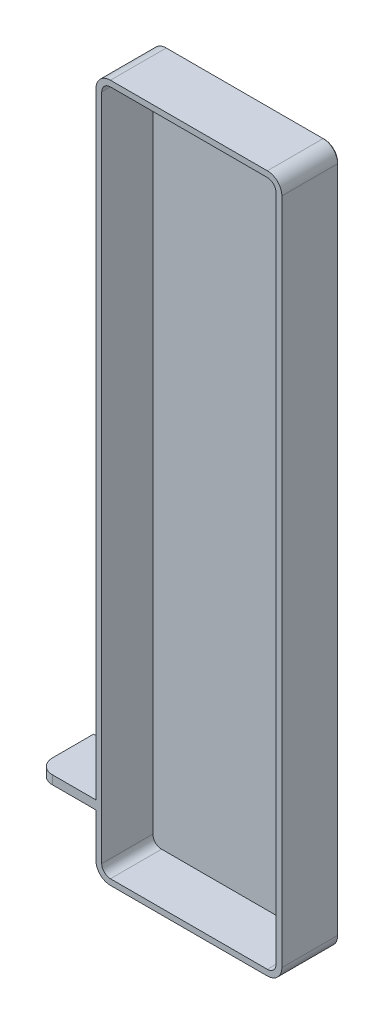
ISO-10303-21;
HEADER;
FILE_DESCRIPTION(('STEP AP214'),'2;1');
FILE_NAME('part.step','',(''),(''),'','','');
FILE_SCHEMA(('AUTOMOTIVE_DESIGN { 1 0 10303 214 1 1 1 1 }'));
ENDSEC;
DATA;
#1=APPLICATION_CONTEXT('core data for automotive mechanical design processes');
#2=APPLICATION_PROTOCOL_DEFINITION('international standard','automotive_design',2000,#1);
#3=PRODUCT_CONTEXT('',#1,'mechanical');
#4=PRODUCT('Part','Part','',(#3));
#5=PRODUCT_RELATED_PRODUCT_CATEGORY('part','',(#4));
#6=PRODUCT_DEFINITION_FORMATION('','',#4);
#7=PRODUCT_DEFINITION_CONTEXT('part definition',#1,'design');
#8=PRODUCT_DEFINITION('design','',#6,#7);
#9=PRODUCT_DEFINITION_SHAPE('','',#8);
#10=(LENGTH_UNIT() NAMED_UNIT(*) SI_UNIT(.MILLI.,.METRE.));
#11=(NAMED_UNIT(*) PLANE_ANGLE_UNIT() SI_UNIT($,.RADIAN.));
#12=(NAMED_UNIT(*) SI_UNIT($,.STERADIAN.) SOLID_ANGLE_UNIT());
#13=UNCERTAINTY_MEASURE_WITH_UNIT(LENGTH_MEASURE(1.E-05),#10,'distance_accuracy_value','');
#14=(GEOMETRIC_REPRESENTATION_CONTEXT(3) GLOBAL_UNCERTAINTY_ASSIGNED_CONTEXT((#13)) GLOBAL_UNIT_ASSIGNED_CONTEXT((#10,
#11,#12)) REPRESENTATION_CONTEXT('',''));
#15=CARTESIAN_POINT('',(0.,0.,0.));
#16=DIRECTION('',(0.,0.,1.));
#17=DIRECTION('',(1.,0.,0.));
#18=AXIS2_PLACEMENT_3D('',#15,#16,#17);
#19=CARTESIAN_POINT('',(-4.54485946099759E-06,240.000002017447,19.6));
#20=DIRECTION('',(1.,0.,0.));
#21=DIRECTION('',(0.,1.,0.));
#22=AXIS2_PLACEMENT_3D('',#19,#20,#21);
#23=PLANE('',#22);
#24=DIRECTION('',(0.,0.,1.));
#25=VECTOR('',#24,1.);
#26=CARTESIAN_POINT('',(-4.54485943324201E-06,20.0000020174472,0.));
#27=LINE('',#26,#25);
#28=CARTESIAN_POINT('',(-4.54485943324201E-06,20.0000020174472,0.400000000000039));
#29=VERTEX_POINT('',#28);
#30=CARTESIAN_POINT('',(-4.54485943324201E-06,20.0000020174472,19.6));
#31=VERTEX_POINT('',#30);
#32=EDGE_CURVE('E432',#29,#31,#27,.T.);
#33=ORIENTED_EDGE('',*,*,#32,.F.);
#34=DIRECTION('',(0.,-1.,0.));
#35=VECTOR('',#34,1.);
#36=CARTESIAN_POINT('',(-4.54485943382025E-06,5.0000020174472,0.400000000000039));
#37=LINE('',#36,#35);
#38=CARTESIAN_POINT('',(-4.54485943324201E-06,5.0000020174472,0.400000000000039));
#39=VERTEX_POINT('',#38);
#40=EDGE_CURVE('E72',#29,#39,#37,.T.);
#41=ORIENTED_EDGE('',*,*,#40,.T.);
#42=DIRECTION('',(0.,0.,-1.));
#43=VECTOR('',#42,1.);
#44=CARTESIAN_POINT('',(-4.54485943324201E-06,5.0000020174472,19.6));
#45=LINE('',#44,#43);
#46=CARTESIAN_POINT('',(-4.54485943324201E-06,5.0000020174472,19.6));
#47=VERTEX_POINT('',#46);
#48=EDGE_CURVE('E318',#39,#47,#45,.F.);
#49=ORIENTED_EDGE('',*,*,#48,.T.);
#50=DIRECTION('',(0.,-1.,0.));
#51=VECTOR('',#50,1.);
#52=CARTESIAN_POINT('',(-4.54485946099759E-06,240.000002017447,19.6));
#53=LINE('',#52,#51);
#54=EDGE_CURVE('E302',#31,#47,#53,.T.);
#55=ORIENTED_EDGE('',*,*,#54,.F.);
#56=EDGE_LOOP('',(#33,#41,#49,#55));
#57=FACE_BOUND('',#56,.T.);
#58=ADVANCED_FACE('F47',(#57),#23,.F.);
#59=DIRECTION('',(0.,0.,-1.));
#60=VECTOR('',#59,1.);
#61=CARTESIAN_POINT('',(-4.54485946099759E-06,235.000002017447,19.6));
#62=LINE('',#61,#60);
#63=CARTESIAN_POINT('',(-4.54485946099759E-06,235.000002017447,19.6));
#64=VERTEX_POINT('',#63);
#65=CARTESIAN_POINT('',(-4.54485946099759E-06,235.000002017447,0.400000000000039));
#66=VERTEX_POINT('',#65);
#67=EDGE_CURVE('E315',#64,#66,#62,.T.);
#68=ORIENTED_EDGE('',*,*,#67,.T.);
#69=DIRECTION('',(0.,-1.,0.));
#70=VECTOR('',#69,1.);
#71=CARTESIAN_POINT('',(-4.54485943590192E-06,23.0000020174472,0.400000000000039));
#72=LINE('',#71,#70);
#73=CARTESIAN_POINT('',(-4.54485943324201E-06,23.0000020174472,0.400000000000039));
#74=VERTEX_POINT('',#73);
#75=EDGE_CURVE('E388',#66,#74,#72,.T.);
#76=ORIENTED_EDGE('',*,*,#75,.T.);
#77=DIRECTION('',(0.,0.,-1.));
#78=VECTOR('',#77,1.);
#79=CARTESIAN_POINT('',(-4.54485943324201E-06,23.0000020174472,0.));
#80=LINE('',#79,#78);
#81=CARTESIAN_POINT('',(-4.54485943324201E-06,23.0000020174472,19.6));
#82=VERTEX_POINT('',#81);
#83=EDGE_CURVE('E437',#82,#74,#80,.T.);
#84=ORIENTED_EDGE('',*,*,#83,.F.);
#85=EDGE_CURVE('E303',#64,#82,#53,.T.);
#86=ORIENTED_EDGE('',*,*,#85,.F.);
#87=EDGE_LOOP('',(#68,#76,#84,#86));
#88=FACE_BOUND('',#87,.T.);
#89=ADVANCED_FACE('F506',(#88),#23,.F.);
#90=CARTESIAN_POINT('',(63.9999954551405,240.000002017447,19.6));
#91=DIRECTION('',(-1.,0.,0.));
#92=DIRECTION('',(0.,-1.,0.));
#93=AXIS2_PLACEMENT_3D('',#90,#91,#92);
#94=PLANE('',#93);
#95=DIRECTION('',(0.,0.,-1.));
#96=VECTOR('',#95,1.);
#97=CARTESIAN_POINT('',(63.9999954551406,5.0000020174472,19.6));
#98=LINE('',#97,#96);
#99=CARTESIAN_POINT('',(63.9999954551406,5.0000020174472,19.6));
#100=VERTEX_POINT('',#99);
#101=CARTESIAN_POINT('',(63.9999954551406,5.0000020174472,0.400000000000039));
#102=VERTEX_POINT('',#101);
#103=EDGE_CURVE('E331',#100,#102,#98,.T.);
#104=ORIENTED_EDGE('',*,*,#103,.T.);
#105=DIRECTION('',(0.,1.,0.));
#106=VECTOR('',#105,1.);
#107=CARTESIAN_POINT('',(63.9999954551405,235.000002017447,0.400000000000039));
#108=LINE('',#107,#106);
#109=CARTESIAN_POINT('',(63.9999954551405,235.000002017447,0.400000000000039));
#110=VERTEX_POINT('',#109);
#111=EDGE_CURVE('E379',#102,#110,#108,.T.);
#112=ORIENTED_EDGE('',*,*,#111,.T.);
#113=DIRECTION('',(0.,0.,-1.));
#114=VECTOR('',#113,1.);
#115=CARTESIAN_POINT('',(63.9999954551405,235.000002017447,19.6));
#116=LINE('',#115,#114);
#117=CARTESIAN_POINT('',(63.9999954551405,235.000002017447,19.6));
#118=VERTEX_POINT('',#117);
#119=EDGE_CURVE('E329',#110,#118,#116,.F.);
#120=ORIENTED_EDGE('',*,*,#119,.T.);
#121=DIRECTION('',(0.,1.,0.));
#122=VECTOR('',#121,1.);
#123=CARTESIAN_POINT('',(63.9999954551405,240.000002017447,19.6));
#124=LINE('',#123,#122);
#125=EDGE_CURVE('E295',#100,#118,#124,.T.);
#126=ORIENTED_EDGE('',*,*,#125,.F.);
#127=EDGE_LOOP('',(#104,#112,#120,#126));
#128=FACE_BOUND('',#127,.T.);
#129=ADVANCED_FACE('F513',(#128),#94,.F.);
#130=CARTESIAN_POINT('',(63.9999954551405,240.000002017447,19.6));
#131=DIRECTION('',(0.,-1.,0.));
#132=DIRECTION('',(0.,0.,-1.));
#133=AXIS2_PLACEMENT_3D('',#130,#131,#132);
#134=PLANE('',#133);
#135=DIRECTION('',(0.,0.,-1.));
#136=VECTOR('',#135,1.);
#137=CARTESIAN_POINT('',(58.9999954551405,240.000002017447,19.6));
#138=LINE('',#137,#136);
#139=CARTESIAN_POINT('',(58.9999954551405,240.000002017447,19.6));
#140=VERTEX_POINT('',#139);
#141=CARTESIAN_POINT('',(58.9999954551405,240.000002017447,0.400000000000039));
#142=VERTEX_POINT('',#141);
#143=EDGE_CURVE('E336',#140,#142,#138,.T.);
#144=ORIENTED_EDGE('',*,*,#143,.T.);
#145=DIRECTION('',(-1.,0.,0.));
#146=VECTOR('',#145,1.);
#147=CARTESIAN_POINT('',(4.99999545514054,240.000002017447,0.400000000000039));
#148=LINE('',#147,#146);
#149=CARTESIAN_POINT('',(4.99999545514054,240.000002017447,0.400000000000039));
#150=VERTEX_POINT('',#149);
#151=EDGE_CURVE('E384',#142,#150,#148,.T.);
#152=ORIENTED_EDGE('',*,*,#151,.T.);
#153=DIRECTION('',(0.,0.,-1.));
#154=VECTOR('',#153,1.);
#155=CARTESIAN_POINT('',(4.99999545514054,240.000002017447,19.6));
#156=LINE('',#155,#154);
#157=CARTESIAN_POINT('',(4.99999545514054,240.000002017447,19.6));
#158=VERTEX_POINT('',#157);
#159=EDGE_CURVE('E334',#150,#158,#156,.F.);
#160=ORIENTED_EDGE('',*,*,#159,.T.);
#161=DIRECTION('',(-1.,0.,0.));
#162=VECTOR('',#161,1.);
#163=CARTESIAN_POINT('',(63.9999954551405,240.000002017447,19.6));
#164=LINE('',#163,#162);
#165=EDGE_CURVE('E299',#140,#158,#164,.T.);
#166=ORIENTED_EDGE('',*,*,#165,.F.);
#167=EDGE_LOOP('',(#144,#152,#160,#166));
#168=FACE_BOUND('',#167,.T.);
#169=ADVANCED_FACE('F519',(#168),#134,.F.);
#170=CARTESIAN_POINT('',(63.9999954551406,2.01744719237687E-06,19.6));
#171=DIRECTION('',(0.,1.,0.));
#172=DIRECTION('',(-1.,0.,0.));
#173=AXIS2_PLACEMENT_3D('',#170,#171,#172);
#174=PLANE('',#173);
#175=DIRECTION('',(0.,0.,-1.));
#176=VECTOR('',#175,1.);
#177=CARTESIAN_POINT('',(4.99999545514057,2.01744718598008E-06,19.6));
#178=LINE('',#177,#176);
#179=CARTESIAN_POINT('',(4.99999545514057,2.01744718598008E-06,19.6));
#180=VERTEX_POINT('',#179);
#181=CARTESIAN_POINT('',(4.99999545514057,2.01744718598008E-06,0.400000000000039));
#182=VERTEX_POINT('',#181);
#183=EDGE_CURVE('E313',#180,#182,#178,.T.);
#184=ORIENTED_EDGE('',*,*,#183,.T.);
#185=DIRECTION('',(1.,0.,0.));
#186=VECTOR('',#185,1.);
#187=CARTESIAN_POINT('',(58.9999954551406,2.01744719183477E-06,0.400000000000039));
#188=LINE('',#187,#186);
#189=CARTESIAN_POINT('',(58.9999954551406,2.01744719183477E-06,0.400000000000039));
#190=VERTEX_POINT('',#189);
#191=EDGE_CURVE('E12',#182,#190,#188,.T.);
#192=ORIENTED_EDGE('',*,*,#191,.T.);
#193=DIRECTION('',(0.,0.,-1.));
#194=VECTOR('',#193,1.);
#195=CARTESIAN_POINT('',(58.9999954551406,2.01744719183477E-06,19.6));
#196=LINE('',#195,#194);
#197=CARTESIAN_POINT('',(58.9999954551406,2.01744719183477E-06,19.6));
#198=VERTEX_POINT('',#197);
#199=EDGE_CURVE('E310',#190,#198,#196,.F.);
#200=ORIENTED_EDGE('',*,*,#199,.T.);
#201=DIRECTION('',(1.,0.,0.));
#202=VECTOR('',#201,1.);
#203=CARTESIAN_POINT('',(63.9999954551406,2.01744719237687E-06,19.6));
#204=LINE('',#203,#202);
#205=EDGE_CURVE('E306',#180,#198,#204,.T.);
#206=ORIENTED_EDGE('',*,*,#205,.F.);
#207=EDGE_LOOP('',(#184,#192,#200,#206));
#208=FACE_BOUND('',#207,.T.);
#209=ADVANCED_FACE('F517',(#208),#174,.F.);
#210=CARTESIAN_POINT('',(150.76986,-0.56542,19.6));
#211=DIRECTION('',(0.,0.,-1.));
#212=DIRECTION('',(-1.,0.,0.));
#213=AXIS2_PLACEMENT_3D('',#210,#211,#212);
#214=PLANE('',#213);
#215=CARTESIAN_POINT('',(4.99999545514057,5.00000201744719,19.6));
#216=DIRECTION('',(0.,0.,1.));
#217=DIRECTION('',(1.,0.,0.));
#218=AXIS2_PLACEMENT_3D('',#215,#216,#217);
#219=CIRCLE('',#218,3.);
#220=CARTESIAN_POINT('',(1.99999545514057,5.0000020174472,19.6));
#221=VERTEX_POINT('',#220);
#222=CARTESIAN_POINT('',(4.99999545514057,2.00000201744718,19.6));
#223=VERTEX_POINT('',#222);
#224=EDGE_CURVE('E467',#221,#223,#219,.T.);
#225=ORIENTED_EDGE('',*,*,#224,.F.);
#226=DIRECTION('',(0.,-1.,0.));
#227=VECTOR('',#226,1.);
#228=CARTESIAN_POINT('',(1.99999545514054,235.000002017447,19.6));
#229=LINE('',#228,#227);
#230=CARTESIAN_POINT('',(1.99999545514054,235.000002017447,19.6));
#231=VERTEX_POINT('',#230);
#232=EDGE_CURVE('E247',#231,#221,#229,.T.);
#233=ORIENTED_EDGE('',*,*,#232,.F.);
#234=CARTESIAN_POINT('',(4.99999545514054,235.000002017447,19.6));
#235=DIRECTION('',(0.,0.,1.));
#236=DIRECTION('',(1.,0.,0.));
#237=AXIS2_PLACEMENT_3D('',#234,#235,#236);
#238=CIRCLE('',#237,3.);
#239=CARTESIAN_POINT('',(4.99999545514054,238.000002017447,19.6));
#240=VERTEX_POINT('',#239);
#241=EDGE_CURVE('E263',#240,#231,#238,.T.);
#242=ORIENTED_EDGE('',*,*,#241,.F.);
#243=DIRECTION('',(-1.,0.,0.));
#244=VECTOR('',#243,1.);
#245=CARTESIAN_POINT('',(58.9999954551405,238.000002017447,19.6));
#246=LINE('',#245,#244);
#247=CARTESIAN_POINT('',(58.9999954551405,238.000002017447,19.6));
#248=VERTEX_POINT('',#247);
#249=EDGE_CURVE('E255',#248,#240,#246,.T.);
#250=ORIENTED_EDGE('',*,*,#249,.F.);
#251=CARTESIAN_POINT('',(58.9999954551405,235.000002017447,19.6));
#252=DIRECTION('',(0.,0.,1.));
#253=DIRECTION('',(1.,0.,0.));
#254=AXIS2_PLACEMENT_3D('',#251,#252,#253);
#255=CIRCLE('',#254,3.);
#256=CARTESIAN_POINT('',(61.9999954551405,235.000002017447,19.6));
#257=VERTEX_POINT('',#256);
#258=EDGE_CURVE('E259',#257,#248,#255,.T.);
#259=ORIENTED_EDGE('',*,*,#258,.F.);
#260=DIRECTION('',(0.,1.,0.));
#261=VECTOR('',#260,1.);
#262=CARTESIAN_POINT('',(61.9999954551406,5.0000020174472,19.6));
#263=LINE('',#262,#261);
#264=CARTESIAN_POINT('',(61.9999954551406,5.0000020174472,19.6));
#265=VERTEX_POINT('',#264);
#266=EDGE_CURVE('E455',#265,#257,#263,.T.);
#267=ORIENTED_EDGE('',*,*,#266,.F.);
#268=CARTESIAN_POINT('',(58.9999954551406,5.0000020174472,19.6));
#269=DIRECTION('',(0.,0.,1.));
#270=DIRECTION('',(1.,0.,0.));
#271=AXIS2_PLACEMENT_3D('',#268,#269,#270);
#272=CIRCLE('',#271,3.);
#273=CARTESIAN_POINT('',(58.9999954551406,2.00000201744719,19.6));
#274=VERTEX_POINT('',#273);
#275=EDGE_CURVE('E459',#274,#265,#272,.T.);
#276=ORIENTED_EDGE('',*,*,#275,.F.);
#277=DIRECTION('',(1.,0.,0.));
#278=VECTOR('',#277,1.);
#279=CARTESIAN_POINT('',(4.99999545514057,2.00000201744718,19.6));
#280=LINE('',#279,#278);
#281=EDGE_CURVE('E463',#223,#274,#280,.T.);
#282=ORIENTED_EDGE('',*,*,#281,.F.);
#283=EDGE_LOOP('',(#225,#233,#242,#250,#259,#267,#276,#282));
#284=FACE_BOUND('',#283,.T.);
#285=DIRECTION('',(1.,0.,0.));
#286=VECTOR('',#285,1.);
#287=CARTESIAN_POINT('',(-20.0000045448594,23.0000020174472,19.6));
#288=LINE('',#287,#286);
#289=CARTESIAN_POINT('',(-15.0000045448594,23.0000020174472,19.6));
#290=VERTEX_POINT('',#289);
#291=EDGE_CURVE('E449',#290,#82,#288,.T.);
#292=ORIENTED_EDGE('',*,*,#291,.F.);
#293=DIRECTION('',(0.,1.,0.));
#294=VECTOR('',#293,1.);
#295=CARTESIAN_POINT('',(-15.0000045448594,20.0000020174472,19.6));
#296=LINE('',#295,#294);
#297=CARTESIAN_POINT('',(-15.0000045448594,20.0000020174472,19.6));
#298=VERTEX_POINT('',#297);
#299=EDGE_CURVE('E344',#290,#298,#296,.F.);
#300=ORIENTED_EDGE('',*,*,#299,.T.);
#301=DIRECTION('',(1.,0.,0.));
#302=VECTOR('',#301,1.);
#303=CARTESIAN_POINT('',(-20.0000045448594,20.0000020174472,19.6));
#304=LINE('',#303,#302);
#305=EDGE_CURVE('E451',#298,#31,#304,.T.);
#306=ORIENTED_EDGE('',*,*,#305,.T.);
#307=ORIENTED_EDGE('',*,*,#54,.T.);
#308=CARTESIAN_POINT('',(4.99999545514057,5.00000201744719,19.6));
#309=DIRECTION('',(0.,0.,-1.));
#310=DIRECTION('',(-1.,0.,0.));
#311=AXIS2_PLACEMENT_3D('',#308,#309,#310);
#312=CIRCLE('',#311,5.);
#313=EDGE_CURVE('E327',#47,#180,#312,.F.);
#314=ORIENTED_EDGE('',*,*,#313,.T.);
#315=ORIENTED_EDGE('',*,*,#205,.T.);
#316=CARTESIAN_POINT('',(58.9999954551406,5.0000020174472,19.6));
#317=DIRECTION('',(0.,0.,-1.));
#318=DIRECTION('',(-1.,0.,0.));
#319=AXIS2_PLACEMENT_3D('',#316,#317,#318);
#320=CIRCLE('',#319,5.);
#321=EDGE_CURVE('E324',#198,#100,#320,.F.);
#322=ORIENTED_EDGE('',*,*,#321,.T.);
#323=ORIENTED_EDGE('',*,*,#125,.T.);
#324=CARTESIAN_POINT('',(58.9999954551405,235.000002017447,19.6));
#325=DIRECTION('',(0.,0.,-1.));
#326=DIRECTION('',(-1.,0.,0.));
#327=AXIS2_PLACEMENT_3D('',#324,#325,#326);
#328=CIRCLE('',#327,5.);
#329=EDGE_CURVE('E322',#118,#140,#328,.F.);
#330=ORIENTED_EDGE('',*,*,#329,.T.);
#331=ORIENTED_EDGE('',*,*,#165,.T.);
#332=CARTESIAN_POINT('',(4.99999545514054,235.000002017447,19.6));
#333=DIRECTION('',(0.,0.,-1.));
#334=DIRECTION('',(-1.,0.,0.));
#335=AXIS2_PLACEMENT_3D('',#332,#333,#334);
#336=CIRCLE('',#335,5.);
#337=EDGE_CURVE('E320',#158,#64,#336,.F.);
#338=ORIENTED_EDGE('',*,*,#337,.T.);
#339=ORIENTED_EDGE('',*,*,#85,.T.);
#340=EDGE_LOOP('',(#292,#300,#306,#307,#314,#315,#322,#323,#330,#331,#338,#339));
#341=FACE_BOUND('',#340,.T.);
#342=ADVANCED_FACE('F476',(#284,#341),#214,.F.);
#343=CARTESIAN_POINT('',(150.76986,-0.56542,0.));
#344=DIRECTION('',(0.,0.,-1.));
#345=DIRECTION('',(-1.,0.,0.));
#346=AXIS2_PLACEMENT_3D('',#343,#344,#345);
#347=PLANE('',#346);
#348=DIRECTION('',(0.,-1.,0.));
#349=VECTOR('',#348,1.);
#350=CARTESIAN_POINT('',(63.5999954551405,5.0000020174472,0.));
#351=LINE('',#350,#349);
#352=CARTESIAN_POINT('',(63.5999954551405,235.000002017447,0.));
#353=VERTEX_POINT('',#352);
#354=CARTESIAN_POINT('',(63.5999954551405,5.0000020174472,0.));
#355=VERTEX_POINT('',#354);
#356=EDGE_CURVE('E370',#353,#355,#351,.T.);
#357=ORIENTED_EDGE('',*,*,#356,.T.);
#358=CARTESIAN_POINT('',(58.9999954551406,5.0000020174472,0.));
#359=DIRECTION('',(0.,0.,-1.));
#360=DIRECTION('',(-1.,0.,0.));
#361=AXIS2_PLACEMENT_3D('',#358,#359,#360);
#362=CIRCLE('',#361,4.59999999999997);
#363=CARTESIAN_POINT('',(58.9999954551406,0.400002017447231,0.));
#364=VERTEX_POINT('',#363);
#365=EDGE_CURVE('E373',#355,#364,#362,.T.);
#366=ORIENTED_EDGE('',*,*,#365,.T.);
#367=DIRECTION('',(-1.,0.,0.));
#368=VECTOR('',#367,1.);
#369=CARTESIAN_POINT('',(4.99999545514057,0.400002017447225,0.));
#370=LINE('',#369,#368);
#371=CARTESIAN_POINT('',(4.99999545514057,0.400002017447225,0.));
#372=VERTEX_POINT('',#371);
#373=EDGE_CURVE('E349',#364,#372,#370,.T.);
#374=ORIENTED_EDGE('',*,*,#373,.T.);
#375=CARTESIAN_POINT('',(4.99999545514057,5.00000201744719,0.));
#376=DIRECTION('',(0.,0.,-1.));
#377=DIRECTION('',(-1.,0.,0.));
#378=AXIS2_PLACEMENT_3D('',#375,#376,#377);
#379=CIRCLE('',#378,4.59999999999996);
#380=CARTESIAN_POINT('',(0.399995455140611,5.0000020174472,0.));
#381=VERTEX_POINT('',#380);
#382=EDGE_CURVE('E351',#372,#381,#379,.T.);
#383=ORIENTED_EDGE('',*,*,#382,.T.);
#384=DIRECTION('',(0.,1.,0.));
#385=VECTOR('',#384,1.);
#386=CARTESIAN_POINT('',(0.399995455140604,20.0000020174472,0.));
#387=LINE('',#386,#385);
#388=CARTESIAN_POINT('',(0.399995455140604,20.4000020174472,0.));
#389=VERTEX_POINT('',#388);
#390=EDGE_CURVE('E353',#381,#389,#387,.T.);
#391=ORIENTED_EDGE('',*,*,#390,.T.);
#392=DIRECTION('',(-1.,0.,0.));
#393=VECTOR('',#392,1.);
#394=CARTESIAN_POINT('',(-20.0000045448594,20.4000020174472,0.));
#395=LINE('',#394,#393);
#396=CARTESIAN_POINT('',(-19.6000045448594,20.4000020174472,0.));
#397=VERTEX_POINT('',#396);
#398=EDGE_CURVE('E355',#389,#397,#395,.T.);
#399=ORIENTED_EDGE('',*,*,#398,.T.);
#400=DIRECTION('',(0.,1.,0.));
#401=VECTOR('',#400,1.);
#402=CARTESIAN_POINT('',(-19.6000045448594,-0.56542,0.));
#403=LINE('',#402,#401);
#404=CARTESIAN_POINT('',(-19.6000045448594,22.6000020174472,0.));
#405=VERTEX_POINT('',#404);
#406=EDGE_CURVE('E357',#397,#405,#403,.T.);
#407=ORIENTED_EDGE('',*,*,#406,.T.);
#408=DIRECTION('',(1.,0.,0.));
#409=VECTOR('',#408,1.);
#410=CARTESIAN_POINT('',(-4.54485943319575E-06,22.6000020174472,0.));
#411=LINE('',#410,#409);
#412=CARTESIAN_POINT('',(0.399995455140603,22.6000020174472,0.));
#413=VERTEX_POINT('',#412);
#414=EDGE_CURVE('E359',#405,#413,#411,.T.);
#415=ORIENTED_EDGE('',*,*,#414,.T.);
#416=DIRECTION('',(0.,1.,0.));
#417=VECTOR('',#416,1.);
#418=CARTESIAN_POINT('',(0.399995455140579,235.000002017447,0.));
#419=LINE('',#418,#417);
#420=CARTESIAN_POINT('',(0.399995455140579,235.000002017447,0.));
#421=VERTEX_POINT('',#420);
#422=EDGE_CURVE('E361',#413,#421,#419,.T.);
#423=ORIENTED_EDGE('',*,*,#422,.T.);
#424=CARTESIAN_POINT('',(4.99999545514054,235.000002017447,0.));
#425=DIRECTION('',(0.,0.,-1.));
#426=DIRECTION('',(-1.,0.,0.));
#427=AXIS2_PLACEMENT_3D('',#424,#425,#426);
#428=CIRCLE('',#427,4.59999999999997);
#429=CARTESIAN_POINT('',(4.99999545514054,239.600002017447,0.));
#430=VERTEX_POINT('',#429);
#431=EDGE_CURVE('E364',#421,#430,#428,.T.);
#432=ORIENTED_EDGE('',*,*,#431,.T.);
#433=DIRECTION('',(1.,0.,0.));
#434=VECTOR('',#433,1.);
#435=CARTESIAN_POINT('',(58.9999954551405,239.600002017447,0.));
#436=LINE('',#435,#434);
#437=CARTESIAN_POINT('',(58.9999954551405,239.600002017447,0.));
#438=VERTEX_POINT('',#437);
#439=EDGE_CURVE('E366',#430,#438,#436,.T.);
#440=ORIENTED_EDGE('',*,*,#439,.T.);
#441=CARTESIAN_POINT('',(58.9999954551405,235.000002017447,0.));
#442=DIRECTION('',(0.,0.,-1.));
#443=DIRECTION('',(-1.,0.,0.));
#444=AXIS2_PLACEMENT_3D('',#441,#442,#443);
#445=CIRCLE('',#444,4.59999999999997);
#446=EDGE_CURVE('E368',#438,#353,#445,.T.);
#447=ORIENTED_EDGE('',*,*,#446,.T.);
#448=EDGE_LOOP('',(#357,#366,#374,#383,#391,#399,#407,#415,#423,#432,#440,#447));
#449=FACE_BOUND('',#448,.T.);
#450=ADVANCED_FACE('F530',(#449),#347,.T.);
#451=CARTESIAN_POINT('',(4.99999545514057,5.00000201744719,19.6));
#452=DIRECTION('',(0.,0.,-1.));
#453=DIRECTION('',(-1.,0.,0.));
#454=AXIS2_PLACEMENT_3D('',#451,#452,#453);
#455=CYLINDRICAL_SURFACE('',#454,5.);
#456=ORIENTED_EDGE('',*,*,#48,.F.);
#457=CARTESIAN_POINT('',(4.99999545514057,5.00000201744719,0.400000000000039));
#458=DIRECTION('',(0.,0.,-1.));
#459=DIRECTION('',(-1.,0.,0.));
#460=AXIS2_PLACEMENT_3D('',#457,#458,#459);
#461=CIRCLE('',#460,5.);
#462=EDGE_CURVE('E57',#39,#182,#461,.F.);
#463=ORIENTED_EDGE('',*,*,#462,.T.);
#464=ORIENTED_EDGE('',*,*,#183,.F.);
#465=ORIENTED_EDGE('',*,*,#313,.F.);
#466=EDGE_LOOP('',(#456,#463,#464,#465));
#467=FACE_BOUND('',#466,.T.);
#468=ADVANCED_FACE('F526',(#467),#455,.T.);
#469=CARTESIAN_POINT('',(58.9999954551406,5.0000020174472,19.6));
#470=DIRECTION('',(0.,0.,-1.));
#471=DIRECTION('',(-1.,0.,0.));
#472=AXIS2_PLACEMENT_3D('',#469,#470,#471);
#473=CYLINDRICAL_SURFACE('',#472,5.);
#474=ORIENTED_EDGE('',*,*,#199,.F.);
#475=CARTESIAN_POINT('',(58.9999954551406,5.0000020174472,0.400000000000039));
#476=DIRECTION('',(0.,0.,-1.));
#477=DIRECTION('',(-1.,0.,0.));
#478=AXIS2_PLACEMENT_3D('',#475,#476,#477);
#479=CIRCLE('',#478,5.);
#480=EDGE_CURVE('E376',#190,#102,#479,.F.);
#481=ORIENTED_EDGE('',*,*,#480,.T.);
#482=ORIENTED_EDGE('',*,*,#103,.F.);
#483=ORIENTED_EDGE('',*,*,#321,.F.);
#484=EDGE_LOOP('',(#474,#481,#482,#483));
#485=FACE_BOUND('',#484,.T.);
#486=ADVANCED_FACE('F529',(#485),#473,.T.);
#487=CARTESIAN_POINT('',(58.9999954551405,235.000002017447,19.6));
#488=DIRECTION('',(0.,0.,-1.));
#489=DIRECTION('',(-1.,0.,0.));
#490=AXIS2_PLACEMENT_3D('',#487,#488,#489);
#491=CYLINDRICAL_SURFACE('',#490,5.);
#492=ORIENTED_EDGE('',*,*,#119,.F.);
#493=CARTESIAN_POINT('',(58.9999954551405,235.000002017447,0.400000000000039));
#494=DIRECTION('',(0.,0.,-1.));
#495=DIRECTION('',(-1.,0.,0.));
#496=AXIS2_PLACEMENT_3D('',#493,#494,#495);
#497=CIRCLE('',#496,5.);
#498=EDGE_CURVE('E382',#110,#142,#497,.F.);
#499=ORIENTED_EDGE('',*,*,#498,.T.);
#500=ORIENTED_EDGE('',*,*,#143,.F.);
#501=ORIENTED_EDGE('',*,*,#329,.F.);
#502=EDGE_LOOP('',(#492,#499,#500,#501));
#503=FACE_BOUND('',#502,.T.);
#504=ADVANCED_FACE('F533',(#503),#491,.T.);
#505=CARTESIAN_POINT('',(4.99999545514054,235.000002017447,19.6));
#506=DIRECTION('',(0.,0.,-1.));
#507=DIRECTION('',(-1.,0.,0.));
#508=AXIS2_PLACEMENT_3D('',#505,#506,#507);
#509=CYLINDRICAL_SURFACE('',#508,5.);
#510=ORIENTED_EDGE('',*,*,#159,.F.);
#511=CARTESIAN_POINT('',(4.99999545514054,235.000002017447,0.400000000000039));
#512=DIRECTION('',(0.,0.,-1.));
#513=DIRECTION('',(-1.,0.,0.));
#514=AXIS2_PLACEMENT_3D('',#511,#512,#513);
#515=CIRCLE('',#514,5.);
#516=EDGE_CURVE('E386',#150,#66,#515,.F.);
#517=ORIENTED_EDGE('',*,*,#516,.T.);
#518=ORIENTED_EDGE('',*,*,#67,.F.);
#519=ORIENTED_EDGE('',*,*,#337,.F.);
#520=EDGE_LOOP('',(#510,#517,#518,#519));
#521=FACE_BOUND('',#520,.T.);
#522=ADVANCED_FACE('F537',(#521),#509,.T.);
#523=CARTESIAN_POINT('',(150.76986,-0.56542,2.));
#524=DIRECTION('',(0.,0.,-1.));
#525=DIRECTION('',(-1.,0.,0.));
#526=AXIS2_PLACEMENT_3D('',#523,#524,#525);
#527=PLANE('',#526);
#528=CARTESIAN_POINT('',(4.99999545514054,235.000002017447,2.));
#529=DIRECTION('',(0.,0.,-1.));
#530=DIRECTION('',(-1.,0.,0.));
#531=AXIS2_PLACEMENT_3D('',#528,#529,#530);
#532=CIRCLE('',#531,3.);
#533=CARTESIAN_POINT('',(4.99999545514054,238.000002017447,2.));
#534=VERTEX_POINT('',#533);
#535=CARTESIAN_POINT('',(1.99999545514054,235.000002017447,2.));
#536=VERTEX_POINT('',#535);
#537=EDGE_CURVE('E252',#534,#536,#532,.F.);
#538=ORIENTED_EDGE('',*,*,#537,.T.);
#539=DIRECTION('',(0.,-1.,0.));
#540=VECTOR('',#539,1.);
#541=CARTESIAN_POINT('',(1.99999545514054,235.000002017447,2.));
#542=LINE('',#541,#540);
#543=CARTESIAN_POINT('',(1.99999545514057,5.0000020174472,2.));
#544=VERTEX_POINT('',#543);
#545=EDGE_CURVE('E244',#536,#544,#542,.T.);
#546=ORIENTED_EDGE('',*,*,#545,.T.);
#547=CARTESIAN_POINT('',(4.99999545514057,5.00000201744719,2.));
#548=DIRECTION('',(0.,0.,-1.));
#549=DIRECTION('',(-1.,0.,0.));
#550=AXIS2_PLACEMENT_3D('',#547,#548,#549);
#551=CIRCLE('',#550,3.);
#552=CARTESIAN_POINT('',(4.99999545514057,2.00000201744718,2.));
#553=VERTEX_POINT('',#552);
#554=EDGE_CURVE('E231',#544,#553,#551,.F.);
#555=ORIENTED_EDGE('',*,*,#554,.T.);
#556=DIRECTION('',(1.,0.,0.));
#557=VECTOR('',#556,1.);
#558=CARTESIAN_POINT('',(4.99999545514057,2.00000201744718,2.));
#559=LINE('',#558,#557);
#560=CARTESIAN_POINT('',(58.9999954551406,2.00000201744719,2.));
#561=VERTEX_POINT('',#560);
#562=EDGE_CURVE('E284',#553,#561,#559,.T.);
#563=ORIENTED_EDGE('',*,*,#562,.T.);
#564=CARTESIAN_POINT('',(58.9999954551406,5.0000020174472,2.));
#565=DIRECTION('',(0.,0.,-1.));
#566=DIRECTION('',(-1.,0.,0.));
#567=AXIS2_PLACEMENT_3D('',#564,#565,#566);
#568=CIRCLE('',#567,3.);
#569=CARTESIAN_POINT('',(61.9999954551406,5.0000020174472,2.));
#570=VERTEX_POINT('',#569);
#571=EDGE_CURVE('E280',#561,#570,#568,.F.);
#572=ORIENTED_EDGE('',*,*,#571,.T.);
#573=DIRECTION('',(0.,1.,0.));
#574=VECTOR('',#573,1.);
#575=CARTESIAN_POINT('',(61.9999954551406,5.0000020174472,2.));
#576=LINE('',#575,#574);
#577=CARTESIAN_POINT('',(61.9999954551405,235.000002017447,2.));
#578=VERTEX_POINT('',#577);
#579=EDGE_CURVE('E275',#570,#578,#576,.T.);
#580=ORIENTED_EDGE('',*,*,#579,.T.);
#581=CARTESIAN_POINT('',(58.9999954551405,235.000002017447,2.));
#582=DIRECTION('',(0.,0.,-1.));
#583=DIRECTION('',(-1.,0.,0.));
#584=AXIS2_PLACEMENT_3D('',#581,#582,#583);
#585=CIRCLE('',#584,3.);
#586=CARTESIAN_POINT('',(58.9999954551405,238.000002017447,2.));
#587=VERTEX_POINT('',#586);
#588=EDGE_CURVE('E271',#578,#587,#585,.F.);
#589=ORIENTED_EDGE('',*,*,#588,.T.);
#590=DIRECTION('',(-1.,0.,0.));
#591=VECTOR('',#590,1.);
#592=CARTESIAN_POINT('',(58.9999954551405,238.000002017447,2.));
#593=LINE('',#592,#591);
#594=EDGE_CURVE('E268',#587,#534,#593,.T.);
#595=ORIENTED_EDGE('',*,*,#594,.T.);
#596=EDGE_LOOP('',(#538,#546,#555,#563,#572,#580,#589,#595));
#597=FACE_BOUND('',#596,.T.);
#598=ADVANCED_FACE('F250',(#597),#527,.F.);
#599=CARTESIAN_POINT('',(1.99999545514054,235.000002017447,-243.507700083591));
#600=DIRECTION('',(-1.,0.,0.));
#601=DIRECTION('',(0.,-1.,0.));
#602=AXIS2_PLACEMENT_3D('',#599,#600,#601);
#603=PLANE('',#602);
#604=DIRECTION('',(0.,0.,1.));
#605=VECTOR('',#604,1.);
#606=CARTESIAN_POINT('',(1.99999545514054,235.000002017447,-243.507700083591));
#607=LINE('',#606,#605);
#608=EDGE_CURVE('E266',#536,#231,#607,.T.);
#609=ORIENTED_EDGE('',*,*,#608,.T.);
#610=ORIENTED_EDGE('',*,*,#232,.T.);
#611=DIRECTION('',(0.,0.,1.));
#612=VECTOR('',#611,1.);
#613=CARTESIAN_POINT('',(1.99999545514057,5.0000020174472,-243.507700083591));
#614=LINE('',#613,#612);
#615=EDGE_CURVE('E235',#544,#221,#614,.T.);
#616=ORIENTED_EDGE('',*,*,#615,.F.);
#617=ORIENTED_EDGE('',*,*,#545,.F.);
#618=EDGE_LOOP('',(#609,#610,#616,#617));
#619=FACE_BOUND('',#618,.T.);
#620=ADVANCED_FACE('F243',(#619),#603,.F.);
#621=CARTESIAN_POINT('',(4.99999545514057,5.00000201744719,-243.507700083591));
#622=DIRECTION('',(0.,0.,1.));
#623=DIRECTION('',(1.,0.,0.));
#624=AXIS2_PLACEMENT_3D('',#621,#622,#623);
#625=CYLINDRICAL_SURFACE('',#624,3.);
#626=ORIENTED_EDGE('',*,*,#615,.T.);
#627=ORIENTED_EDGE('',*,*,#224,.T.);
#628=DIRECTION('',(0.,0.,1.));
#629=VECTOR('',#628,1.);
#630=CARTESIAN_POINT('',(4.99999545514057,2.00000201744718,-243.507700083591));
#631=LINE('',#630,#629);
#632=EDGE_CURVE('E237',#553,#223,#631,.T.);
#633=ORIENTED_EDGE('',*,*,#632,.F.);
#634=ORIENTED_EDGE('',*,*,#554,.F.);
#635=EDGE_LOOP('',(#626,#627,#633,#634));
#636=FACE_BOUND('',#635,.T.);
#637=ADVANCED_FACE('F233',(#636),#625,.F.);
#638=CARTESIAN_POINT('',(4.99999545514057,2.00000201744718,-243.507700083591));
#639=DIRECTION('',(0.,-1.,0.));
#640=DIRECTION('',(1.,0.,0.));
#641=AXIS2_PLACEMENT_3D('',#638,#639,#640);
#642=PLANE('',#641);
#643=ORIENTED_EDGE('',*,*,#632,.T.);
#644=ORIENTED_EDGE('',*,*,#281,.T.);
#645=DIRECTION('',(0.,0.,1.));
#646=VECTOR('',#645,1.);
#647=CARTESIAN_POINT('',(58.9999954551406,2.00000201744719,-243.507700083591));
#648=LINE('',#647,#646);
#649=EDGE_CURVE('E283',#561,#274,#648,.T.);
#650=ORIENTED_EDGE('',*,*,#649,.F.);
#651=ORIENTED_EDGE('',*,*,#562,.F.);
#652=EDGE_LOOP('',(#643,#644,#650,#651));
#653=FACE_BOUND('',#652,.T.);
#654=ADVANCED_FACE('F483',(#653),#642,.F.);
#655=CARTESIAN_POINT('',(58.9999954551406,5.0000020174472,-243.507700083591));
#656=DIRECTION('',(0.,0.,1.));
#657=DIRECTION('',(1.,0.,0.));
#658=AXIS2_PLACEMENT_3D('',#655,#656,#657);
#659=CYLINDRICAL_SURFACE('',#658,3.);
#660=ORIENTED_EDGE('',*,*,#649,.T.);
#661=ORIENTED_EDGE('',*,*,#275,.T.);
#662=DIRECTION('',(0.,0.,1.));
#663=VECTOR('',#662,1.);
#664=CARTESIAN_POINT('',(61.9999954551406,5.0000020174472,-243.507700083591));
#665=LINE('',#664,#663);
#666=EDGE_CURVE('E279',#570,#265,#665,.T.);
#667=ORIENTED_EDGE('',*,*,#666,.F.);
#668=ORIENTED_EDGE('',*,*,#571,.F.);
#669=EDGE_LOOP('',(#660,#661,#667,#668));
#670=FACE_BOUND('',#669,.T.);
#671=ADVANCED_FACE('F486',(#670),#659,.F.);
#672=CARTESIAN_POINT('',(61.9999954551406,5.0000020174472,-243.507700083591));
#673=DIRECTION('',(1.,0.,0.));
#674=DIRECTION('',(0.,1.,0.));
#675=AXIS2_PLACEMENT_3D('',#672,#673,#674);
#676=PLANE('',#675);
#677=ORIENTED_EDGE('',*,*,#666,.T.);
#678=ORIENTED_EDGE('',*,*,#266,.T.);
#679=DIRECTION('',(0.,0.,1.));
#680=VECTOR('',#679,1.);
#681=CARTESIAN_POINT('',(61.9999954551405,235.000002017447,-243.507700083591));
#682=LINE('',#681,#680);
#683=EDGE_CURVE('E274',#578,#257,#682,.T.);
#684=ORIENTED_EDGE('',*,*,#683,.F.);
#685=ORIENTED_EDGE('',*,*,#579,.F.);
#686=EDGE_LOOP('',(#677,#678,#684,#685));
#687=FACE_BOUND('',#686,.T.);
#688=ADVANCED_FACE('F488',(#687),#676,.F.);
#689=CARTESIAN_POINT('',(58.9999954551405,235.000002017447,-243.507700083591));
#690=DIRECTION('',(0.,0.,1.));
#691=DIRECTION('',(1.,0.,0.));
#692=AXIS2_PLACEMENT_3D('',#689,#690,#691);
#693=CYLINDRICAL_SURFACE('',#692,3.);
#694=ORIENTED_EDGE('',*,*,#683,.T.);
#695=ORIENTED_EDGE('',*,*,#258,.T.);
#696=DIRECTION('',(0.,0.,1.));
#697=VECTOR('',#696,1.);
#698=CARTESIAN_POINT('',(58.9999954551405,238.000002017447,-243.507700083591));
#699=LINE('',#698,#697);
#700=EDGE_CURVE('E270',#587,#248,#699,.T.);
#701=ORIENTED_EDGE('',*,*,#700,.F.);
#702=ORIENTED_EDGE('',*,*,#588,.F.);
#703=EDGE_LOOP('',(#694,#695,#701,#702));
#704=FACE_BOUND('',#703,.T.);
#705=ADVANCED_FACE('F492',(#704),#693,.F.);
#706=CARTESIAN_POINT('',(58.9999954551405,238.000002017447,-243.507700083591));
#707=DIRECTION('',(0.,1.,0.));
#708=DIRECTION('',(0.,0.,1.));
#709=AXIS2_PLACEMENT_3D('',#706,#707,#708);
#710=PLANE('',#709);
#711=ORIENTED_EDGE('',*,*,#700,.T.);
#712=ORIENTED_EDGE('',*,*,#249,.T.);
#713=DIRECTION('',(0.,0.,1.));
#714=VECTOR('',#713,1.);
#715=CARTESIAN_POINT('',(4.99999545514054,238.000002017447,-243.507700083591));
#716=LINE('',#715,#714);
#717=EDGE_CURVE('E267',#534,#240,#716,.T.);
#718=ORIENTED_EDGE('',*,*,#717,.F.);
#719=ORIENTED_EDGE('',*,*,#594,.F.);
#720=EDGE_LOOP('',(#711,#712,#718,#719));
#721=FACE_BOUND('',#720,.T.);
#722=ADVANCED_FACE('F495',(#721),#710,.F.);
#723=CARTESIAN_POINT('',(4.99999545514054,235.000002017447,-243.507700083591));
#724=DIRECTION('',(0.,0.,1.));
#725=DIRECTION('',(1.,0.,0.));
#726=AXIS2_PLACEMENT_3D('',#723,#724,#725);
#727=CYLINDRICAL_SURFACE('',#726,3.);
#728=ORIENTED_EDGE('',*,*,#717,.T.);
#729=ORIENTED_EDGE('',*,*,#241,.T.);
#730=ORIENTED_EDGE('',*,*,#608,.F.);
#731=ORIENTED_EDGE('',*,*,#537,.F.);
#732=EDGE_LOOP('',(#728,#729,#730,#731));
#733=FACE_BOUND('',#732,.T.);
#734=ADVANCED_FACE('F472',(#733),#727,.F.);
#735=CARTESIAN_POINT('',(-20.0000045448594,20.0000020174472,0.));
#736=DIRECTION('',(0.,1.,0.));
#737=DIRECTION('',(0.,0.,1.));
#738=AXIS2_PLACEMENT_3D('',#735,#736,#737);
#739=PLANE('',#738);
#740=DIRECTION('',(0.,0.,1.));
#741=VECTOR('',#740,1.);
#742=CARTESIAN_POINT('',(-20.0000045448594,20.0000020174472,0.));
#743=LINE('',#742,#741);
#744=CARTESIAN_POINT('',(-20.0000045448594,20.0000020174472,0.400000000000039));
#745=VERTEX_POINT('',#744);
#746=CARTESIAN_POINT('',(-20.0000045448594,20.0000020174472,14.6));
#747=VERTEX_POINT('',#746);
#748=EDGE_CURVE('E443',#745,#747,#743,.T.);
#749=ORIENTED_EDGE('',*,*,#748,.F.);
#750=DIRECTION('',(1.,0.,0.));
#751=VECTOR('',#750,1.);
#752=CARTESIAN_POINT('',(-4.54485943324201E-06,20.0000020174472,0.400000000000039));
#753=LINE('',#752,#751);
#754=EDGE_CURVE('E394',#745,#29,#753,.T.);
#755=ORIENTED_EDGE('',*,*,#754,.T.);
#756=ORIENTED_EDGE('',*,*,#32,.T.);
#757=ORIENTED_EDGE('',*,*,#305,.F.);
#758=CARTESIAN_POINT('',(-15.0000045448594,20.0000020174472,14.6));
#759=DIRECTION('',(0.,1.,0.));
#760=DIRECTION('',(0.,0.,1.));
#761=AXIS2_PLACEMENT_3D('',#758,#759,#760);
#762=CIRCLE('',#761,5.);
#763=EDGE_CURVE('E346',#298,#747,#762,.F.);
#764=ORIENTED_EDGE('',*,*,#763,.T.);
#765=EDGE_LOOP('',(#749,#755,#756,#757,#764));
#766=FACE_BOUND('',#765,.T.);
#767=ADVANCED_FACE('F502',(#766),#739,.F.);
#768=CARTESIAN_POINT('',(-20.0000045448594,23.0000020174472,0.));
#769=DIRECTION('',(0.,-1.,0.));
#770=DIRECTION('',(0.,0.,-1.));
#771=AXIS2_PLACEMENT_3D('',#768,#769,#770);
#772=PLANE('',#771);
#773=ORIENTED_EDGE('',*,*,#83,.T.);
#774=DIRECTION('',(-1.,0.,0.));
#775=VECTOR('',#774,1.);
#776=CARTESIAN_POINT('',(-20.0000045448594,23.0000020174472,0.400000000000039));
#777=LINE('',#776,#775);
#778=CARTESIAN_POINT('',(-20.0000045448594,23.0000020174472,0.400000000000039));
#779=VERTEX_POINT('',#778);
#780=EDGE_CURVE('E390',#74,#779,#777,.T.);
#781=ORIENTED_EDGE('',*,*,#780,.T.);
#782=DIRECTION('',(0.,0.,-1.));
#783=VECTOR('',#782,1.);
#784=CARTESIAN_POINT('',(-20.0000045448594,23.0000020174472,0.));
#785=LINE('',#784,#783);
#786=CARTESIAN_POINT('',(-20.0000045448594,23.0000020174472,14.6));
#787=VERTEX_POINT('',#786);
#788=EDGE_CURVE('E446',#787,#779,#785,.T.);
#789=ORIENTED_EDGE('',*,*,#788,.F.);
#790=CARTESIAN_POINT('',(-15.0000045448594,23.0000020174472,14.6));
#791=DIRECTION('',(0.,-1.,0.));
#792=DIRECTION('',(0.,0.,-1.));
#793=AXIS2_PLACEMENT_3D('',#790,#791,#792);
#794=CIRCLE('',#793,5.);
#795=EDGE_CURVE('E342',#787,#290,#794,.F.);
#796=ORIENTED_EDGE('',*,*,#795,.T.);
#797=ORIENTED_EDGE('',*,*,#291,.T.);
#798=EDGE_LOOP('',(#773,#781,#789,#796,#797));
#799=FACE_BOUND('',#798,.T.);
#800=ADVANCED_FACE('F638',(#799),#772,.F.);
#801=CARTESIAN_POINT('',(-20.0000045448594,-0.565420000000002,0.));
#802=DIRECTION('',(-1.,0.,0.));
#803=DIRECTION('',(0.,0.,1.));
#804=AXIS2_PLACEMENT_3D('',#801,#802,#803);
#805=PLANE('',#804);
#806=ORIENTED_EDGE('',*,*,#788,.T.);
#807=DIRECTION('',(0.,-1.,0.));
#808=VECTOR('',#807,1.);
#809=CARTESIAN_POINT('',(-20.0000045448594,-0.565420000000002,0.400000000000039));
#810=LINE('',#809,#808);
#811=EDGE_CURVE('E392',#779,#745,#810,.T.);
#812=ORIENTED_EDGE('',*,*,#811,.T.);
#813=ORIENTED_EDGE('',*,*,#748,.T.);
#814=DIRECTION('',(0.,1.,0.));
#815=VECTOR('',#814,1.);
#816=CARTESIAN_POINT('',(-20.0000045448594,23.0000020174472,14.6));
#817=LINE('',#816,#815);
#818=EDGE_CURVE('E339',#747,#787,#817,.T.);
#819=ORIENTED_EDGE('',*,*,#818,.T.);
#820=EDGE_LOOP('',(#806,#812,#813,#819));
#821=FACE_BOUND('',#820,.T.);
#822=ADVANCED_FACE('F545',(#821),#805,.T.);
#823=CARTESIAN_POINT('',(-15.0000045448594,-0.565420000000002,14.6));
#824=DIRECTION('',(0.,-1.,0.));
#825=DIRECTION('',(0.,0.,-1.));
#826=AXIS2_PLACEMENT_3D('',#823,#824,#825);
#827=CYLINDRICAL_SURFACE('',#826,5.);
#828=ORIENTED_EDGE('',*,*,#763,.F.);
#829=ORIENTED_EDGE('',*,*,#299,.F.);
#830=ORIENTED_EDGE('',*,*,#795,.F.);
#831=ORIENTED_EDGE('',*,*,#818,.F.);
#832=EDGE_LOOP('',(#828,#829,#830,#831));
#833=FACE_BOUND('',#832,.T.);
#834=ADVANCED_FACE('F542',(#833),#827,.T.);
#835=CARTESIAN_POINT('',(150.76986,22.6000020174472,0.));
#836=DIRECTION('',(0.,0.707106781186549,-0.707106781186546));
#837=DIRECTION('',(-1.,0.,0.));
#838=AXIS2_PLACEMENT_3D('',#835,#836,#837);
#839=PLANE('',#838);
#840=DIRECTION('',(-0.577350269189626,0.577350269189624,0.577350269189626));
#841=VECTOR('',#840,1.);
#842=CARTESIAN_POINT('',(-12.144863872377,15.1448613449648,-7.45514067248235));
#843=LINE('',#842,#841);
#844=EDGE_CURVE('E425',#779,#405,#843,.F.);
#845=ORIENTED_EDGE('',*,*,#844,.F.);
#846=ORIENTED_EDGE('',*,*,#780,.F.);
#847=DIRECTION('',(0.577350269189626,-0.577350269189624,-0.577350269189626));
#848=VECTOR('',#847,1.);
#849=CARTESIAN_POINT('',(-72.3333378781927,95.3333353507802,72.7333333333333));
#850=LINE('',#849,#848);
#851=EDGE_CURVE('E52',#413,#74,#850,.F.);
#852=ORIENTED_EDGE('',*,*,#851,.F.);
#853=ORIENTED_EDGE('',*,*,#414,.F.);
#854=EDGE_LOOP('',(#845,#846,#852,#853));
#855=FACE_BOUND('',#854,.T.);
#856=ADVANCED_FACE('F50',(#855),#839,.T.);
#857=CARTESIAN_POINT('',(-4.54485946099759E-06,240.000002017447,0.400000000000039));
#858=DIRECTION('',(-0.707106781186548,0.,-0.707106781186547));
#859=DIRECTION('',(0.,1.,0.));
#860=AXIS2_PLACEMENT_3D('',#857,#858,#859);
#861=PLANE('',#860);
#862=ORIENTED_EDGE('',*,*,#851,.T.);
#863=ORIENTED_EDGE('',*,*,#75,.F.);
#864=DIRECTION('',(-0.707106781186547,0.,0.707106781186548));
#865=VECTOR('',#864,1.);
#866=CARTESIAN_POINT('',(0.399995455140579,235.000002017447,0.));
#867=LINE('',#866,#865);
#868=EDGE_CURVE('E423',#421,#66,#867,.T.);
#869=ORIENTED_EDGE('',*,*,#868,.F.);
#870=ORIENTED_EDGE('',*,*,#422,.F.);
#871=EDGE_LOOP('',(#862,#863,#869,#870));
#872=FACE_BOUND('',#871,.T.);
#873=ADVANCED_FACE('F616',(#872),#861,.T.);
#874=CARTESIAN_POINT('',(-20.0000045448594,-0.565420000000002,0.400000000000039));
#875=DIRECTION('',(0.707106781186548,0.,0.707106781186548));
#876=DIRECTION('',(0.,-1.,0.));
#877=AXIS2_PLACEMENT_3D('',#874,#875,#876);
#878=PLANE('',#877);
#879=ORIENTED_EDGE('',*,*,#844,.T.);
#880=ORIENTED_EDGE('',*,*,#406,.F.);
#881=DIRECTION('',(-0.577350269189625,-0.577350269189627,0.577350269189625));
#882=VECTOR('',#881,1.);
#883=CARTESIAN_POINT('',(-20.0000045448594,20.0000020174472,0.400000000000039));
#884=LINE('',#883,#882);
#885=EDGE_CURVE('E420',#745,#397,#884,.F.);
#886=ORIENTED_EDGE('',*,*,#885,.F.);
#887=ORIENTED_EDGE('',*,*,#811,.F.);
#888=EDGE_LOOP('',(#879,#880,#886,#887));
#889=FACE_BOUND('',#888,.T.);
#890=ADVANCED_FACE('F610',(#889),#878,.F.);
#891=CARTESIAN_POINT('',(4.99999545514054,235.000002017447,0.));
#892=DIRECTION('',(0.,0.,1.));
#893=DIRECTION('',(1.,0.,0.));
#894=AXIS2_PLACEMENT_3D('',#891,#892,#893);
#895=CONICAL_SURFACE('',#894,4.59999999999996,0.785398163397448);
#896=ORIENTED_EDGE('',*,*,#868,.T.);
#897=ORIENTED_EDGE('',*,*,#516,.F.);
#898=DIRECTION('',(0.,0.707106781186548,0.707106781186548));
#899=VECTOR('',#898,1.);
#900=CARTESIAN_POINT('',(4.99999545514054,239.600002017447,0.));
#901=LINE('',#900,#899);
#902=EDGE_CURVE('E417',#430,#150,#901,.T.);
#903=ORIENTED_EDGE('',*,*,#902,.F.);
#904=ORIENTED_EDGE('',*,*,#431,.F.);
#905=EDGE_LOOP('',(#896,#897,#903,#904));
#906=FACE_BOUND('',#905,.T.);
#907=ADVANCED_FACE('F603',(#906),#895,.T.);
#908=CARTESIAN_POINT('',(-20.0000045448594,20.0000020174472,0.400000000000039));
#909=DIRECTION('',(0.,-0.707106781186547,-0.707106781186548));
#910=DIRECTION('',(-1.,0.,0.));
#911=AXIS2_PLACEMENT_3D('',#908,#909,#910);
#912=PLANE('',#911);
#913=ORIENTED_EDGE('',*,*,#885,.T.);
#914=ORIENTED_EDGE('',*,*,#398,.F.);
#915=DIRECTION('',(0.577350269189625,0.577350269189627,-0.577350269189625));
#916=VECTOR('',#915,1.);
#917=CARTESIAN_POINT('',(-6.66667121152609,13.3333353507805,7.06666666666669));
#918=LINE('',#917,#916);
#919=EDGE_CURVE('E414',#29,#389,#918,.T.);
#920=ORIENTED_EDGE('',*,*,#919,.F.);
#921=ORIENTED_EDGE('',*,*,#754,.F.);
#922=EDGE_LOOP('',(#913,#914,#920,#921));
#923=FACE_BOUND('',#922,.T.);
#924=ADVANCED_FACE('F596',(#923),#912,.T.);
#925=CARTESIAN_POINT('',(63.9999954551405,240.000002017447,0.400000000000039));
#926=DIRECTION('',(0.,0.707106781186548,-0.707106781186548));
#927=DIRECTION('',(1.,0.,0.));
#928=AXIS2_PLACEMENT_3D('',#925,#926,#927);
#929=PLANE('',#928);
#930=ORIENTED_EDGE('',*,*,#902,.T.);
#931=ORIENTED_EDGE('',*,*,#151,.F.);
#932=DIRECTION('',(0.,0.707106781186548,0.707106781186548));
#933=VECTOR('',#932,1.);
#934=CARTESIAN_POINT('',(58.9999954551405,239.600002017447,0.));
#935=LINE('',#934,#933);
#936=EDGE_CURVE('E411',#438,#142,#935,.T.);
#937=ORIENTED_EDGE('',*,*,#936,.F.);
#938=ORIENTED_EDGE('',*,*,#439,.F.);
#939=EDGE_LOOP('',(#930,#931,#937,#938));
#940=FACE_BOUND('',#939,.T.);
#941=ADVANCED_FACE('F589',(#940),#929,.T.);
#942=CARTESIAN_POINT('',(-4.54485946099759E-06,240.000002017447,0.400000000000039));
#943=DIRECTION('',(-0.707106781186548,0.,-0.707106781186547));
#944=DIRECTION('',(0.,1.,0.));
#945=AXIS2_PLACEMENT_3D('',#942,#943,#944);
#946=PLANE('',#945);
#947=ORIENTED_EDGE('',*,*,#919,.T.);
#948=ORIENTED_EDGE('',*,*,#390,.F.);
#949=DIRECTION('',(0.707106781186548,0.,-0.707106781186548));
#950=VECTOR('',#949,1.);
#951=CARTESIAN_POINT('',(-4.54485943382025E-06,5.0000020174472,0.400000000000039));
#952=LINE('',#951,#950);
#953=EDGE_CURVE('E408',#39,#381,#952,.T.);
#954=ORIENTED_EDGE('',*,*,#953,.F.);
#955=ORIENTED_EDGE('',*,*,#40,.F.);
#956=EDGE_LOOP('',(#947,#948,#954,#955));
#957=FACE_BOUND('',#956,.T.);
#958=ADVANCED_FACE('F582',(#957),#946,.T.);
#959=CARTESIAN_POINT('',(58.9999954551405,235.000002017447,0.));
#960=DIRECTION('',(0.,0.,1.));
#961=DIRECTION('',(1.,0.,0.));
#962=AXIS2_PLACEMENT_3D('',#959,#960,#961);
#963=CONICAL_SURFACE('',#962,4.59999999999997,0.785398163397443);
#964=ORIENTED_EDGE('',*,*,#936,.T.);
#965=ORIENTED_EDGE('',*,*,#498,.F.);
#966=DIRECTION('',(0.707106781186547,0.,0.707106781186548));
#967=VECTOR('',#966,1.);
#968=CARTESIAN_POINT('',(63.5999954551405,235.000002017447,0.));
#969=LINE('',#968,#967);
#970=EDGE_CURVE('E405',#353,#110,#969,.T.);
#971=ORIENTED_EDGE('',*,*,#970,.F.);
#972=ORIENTED_EDGE('',*,*,#446,.F.);
#973=EDGE_LOOP('',(#964,#965,#971,#972));
#974=FACE_BOUND('',#973,.T.);
#975=ADVANCED_FACE('F575',(#974),#963,.T.);
#976=CARTESIAN_POINT('',(4.99999545514057,5.00000201744719,0.));
#977=DIRECTION('',(0.,0.,1.));
#978=DIRECTION('',(1.,0.,0.));
#979=AXIS2_PLACEMENT_3D('',#976,#977,#978);
#980=CONICAL_SURFACE('',#979,4.59999999999996,0.785398163397448);
#981=ORIENTED_EDGE('',*,*,#953,.T.);
#982=ORIENTED_EDGE('',*,*,#382,.F.);
#983=DIRECTION('',(0.,0.707106781186547,-0.707106781186548));
#984=VECTOR('',#983,1.);
#985=CARTESIAN_POINT('',(4.99999545514057,2.01744718598008E-06,0.400000000000039));
#986=LINE('',#985,#984);
#987=EDGE_CURVE('E402',#182,#372,#986,.T.);
#988=ORIENTED_EDGE('',*,*,#987,.F.);
#989=ORIENTED_EDGE('',*,*,#462,.F.);
#990=EDGE_LOOP('',(#981,#982,#988,#989));
#991=FACE_BOUND('',#990,.T.);
#992=ADVANCED_FACE('F568',(#991),#980,.T.);
#993=CARTESIAN_POINT('',(63.9999954551405,240.000002017447,0.400000000000039));
#994=DIRECTION('',(0.707106781186547,0.,-0.707106781186548));
#995=DIRECTION('',(0.,-1.,0.));
#996=AXIS2_PLACEMENT_3D('',#993,#994,#995);
#997=PLANE('',#996);
#998=ORIENTED_EDGE('',*,*,#970,.T.);
#999=ORIENTED_EDGE('',*,*,#111,.F.);
#1000=DIRECTION('',(0.707106781186548,0.,0.707106781186548));
#1001=VECTOR('',#1000,1.);
#1002=CARTESIAN_POINT('',(63.5999954551405,5.0000020174472,0.));
#1003=LINE('',#1002,#1001);
#1004=EDGE_CURVE('E400',#355,#102,#1003,.T.);
#1005=ORIENTED_EDGE('',*,*,#1004,.F.);
#1006=ORIENTED_EDGE('',*,*,#356,.F.);
#1007=EDGE_LOOP('',(#998,#999,#1005,#1006));
#1008=FACE_BOUND('',#1007,.T.);
#1009=ADVANCED_FACE('F561',(#1008),#997,.T.);
#1010=CARTESIAN_POINT('',(63.9999954551406,2.01744719237687E-06,0.400000000000039));
#1011=DIRECTION('',(0.,-0.707106781186548,-0.707106781186548));
#1012=DIRECTION('',(-1.,0.,0.));
#1013=AXIS2_PLACEMENT_3D('',#1010,#1011,#1012);
#1014=PLANE('',#1013);
#1015=ORIENTED_EDGE('',*,*,#987,.T.);
#1016=ORIENTED_EDGE('',*,*,#373,.F.);
#1017=DIRECTION('',(0.,0.707106781186548,-0.707106781186547));
#1018=VECTOR('',#1017,1.);
#1019=CARTESIAN_POINT('',(58.9999954551406,2.01744719183477E-06,0.400000000000039));
#1020=LINE('',#1019,#1018);
#1021=EDGE_CURVE('E398',#190,#364,#1020,.T.);
#1022=ORIENTED_EDGE('',*,*,#1021,.F.);
#1023=ORIENTED_EDGE('',*,*,#191,.F.);
#1024=EDGE_LOOP('',(#1015,#1016,#1022,#1023));
#1025=FACE_BOUND('',#1024,.T.);
#1026=ADVANCED_FACE('F554',(#1025),#1014,.T.);
#1027=CARTESIAN_POINT('',(58.9999954551406,5.0000020174472,0.));
#1028=DIRECTION('',(0.,0.,1.));
#1029=DIRECTION('',(1.,0.,0.));
#1030=AXIS2_PLACEMENT_3D('',#1027,#1028,#1029);
#1031=CONICAL_SURFACE('',#1030,4.59999999999997,0.785398163397443);
#1032=ORIENTED_EDGE('',*,*,#1004,.T.);
#1033=ORIENTED_EDGE('',*,*,#480,.F.);
#1034=ORIENTED_EDGE('',*,*,#1021,.T.);
#1035=ORIENTED_EDGE('',*,*,#365,.F.);
#1036=EDGE_LOOP('',(#1032,#1033,#1034,#1035));
#1037=FACE_BOUND('',#1036,.T.);
#1038=ADVANCED_FACE('F548',(#1037),#1031,.T.);
#1039=CLOSED_SHELL('',(#58,#89,#129,#169,#209,#342,#450,#468,#486,#504,#522,#598,#620,#637,#654,
#671,#688,#705,#722,#734,#767,#800,#822,#834,#856,#873,#890,#907,#924,#941,#958,#975,#992,#1009,
#1026,#1038));
#1040=MANIFOLD_SOLID_BREP('B2',#1039);
#1041=ADVANCED_BREP_SHAPE_REPRESENTATION('',(#18,#1040),#14);
#1042=SHAPE_DEFINITION_REPRESENTATION(#9,#1041);
ENDSEC;
END-ISO-10303-21;
